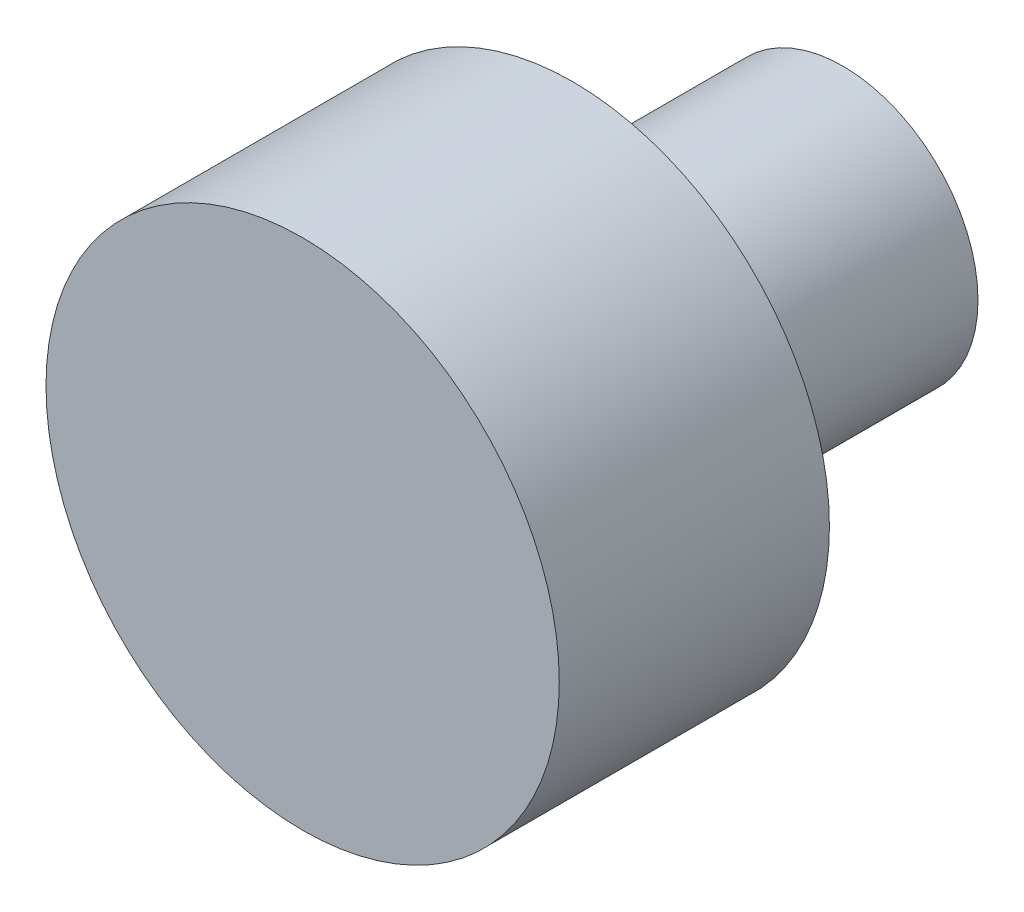
ISO-10303-21;
HEADER;
FILE_DESCRIPTION(('STEP AP214'),'2;1');
FILE_NAME('part.step','',(''),(''),'','','');
FILE_SCHEMA(('AUTOMOTIVE_DESIGN { 1 0 10303 214 1 1 1 1 }'));
ENDSEC;
DATA;
#1=APPLICATION_CONTEXT('core data for automotive mechanical design processes');
#2=APPLICATION_PROTOCOL_DEFINITION('international standard','automotive_design',2000,#1);
#3=PRODUCT_CONTEXT('',#1,'mechanical');
#4=PRODUCT('Part','Part','',(#3));
#5=PRODUCT_RELATED_PRODUCT_CATEGORY('part','',(#4));
#6=PRODUCT_DEFINITION_FORMATION('','',#4);
#7=PRODUCT_DEFINITION_CONTEXT('part definition',#1,'design');
#8=PRODUCT_DEFINITION('design','',#6,#7);
#9=PRODUCT_DEFINITION_SHAPE('','',#8);
#10=(LENGTH_UNIT() NAMED_UNIT(*) SI_UNIT(.MILLI.,.METRE.));
#11=(NAMED_UNIT(*) PLANE_ANGLE_UNIT() SI_UNIT($,.RADIAN.));
#12=(NAMED_UNIT(*) SI_UNIT($,.STERADIAN.) SOLID_ANGLE_UNIT());
#13=UNCERTAINTY_MEASURE_WITH_UNIT(LENGTH_MEASURE(1.E-05),#10,'distance_accuracy_value','');
#14=(GEOMETRIC_REPRESENTATION_CONTEXT(3) GLOBAL_UNCERTAINTY_ASSIGNED_CONTEXT((#13)) GLOBAL_UNIT_ASSIGNED_CONTEXT((#10,
#11,#12)) REPRESENTATION_CONTEXT('',''));
#15=CARTESIAN_POINT('',(0.,0.,0.));
#16=DIRECTION('',(0.,0.,1.));
#17=DIRECTION('',(1.,0.,0.));
#18=AXIS2_PLACEMENT_3D('',#15,#16,#17);
#19=CARTESIAN_POINT('',(0.,0.,0.));
#20=DIRECTION('',(0.,0.,-1.));
#21=DIRECTION('',(-1.,0.,0.));
#22=AXIS2_PLACEMENT_3D('',#19,#20,#21);
#23=CYLINDRICAL_SURFACE('',#22,1.);
#24=CARTESIAN_POINT('',(0.,0.,0.));
#25=DIRECTION('',(0.,0.,1.));
#26=DIRECTION('',(1.,0.,0.));
#27=AXIS2_PLACEMENT_3D('',#24,#25,#26);
#28=CIRCLE('',#27,1.);
#29=CARTESIAN_POINT('',(1.,0.,0.));
#30=VERTEX_POINT('',#29);
#31=EDGE_CURVE('E10',#30,#30,#28,.T.);
#32=ORIENTED_EDGE('',*,*,#31,.F.);
#33=EDGE_LOOP('',(#32));
#34=FACE_BOUND('',#33,.T.);
#35=CARTESIAN_POINT('',(0.,0.,-2.));
#36=DIRECTION('',(0.,0.,1.));
#37=DIRECTION('',(1.,0.,0.));
#38=AXIS2_PLACEMENT_3D('',#35,#36,#37);
#39=CIRCLE('',#38,1.);
#40=CARTESIAN_POINT('',(1.,0.,-2.));
#41=VERTEX_POINT('',#40);
#42=EDGE_CURVE('E45',#41,#41,#39,.T.);
#43=ORIENTED_EDGE('',*,*,#42,.T.);
#44=EDGE_LOOP('',(#43));
#45=FACE_BOUND('',#44,.T.);
#46=ADVANCED_FACE('F39',(#34,#45),#23,.T.);
#47=CARTESIAN_POINT('',(0.,0.,-2.));
#48=DIRECTION('',(0.,0.,1.));
#49=DIRECTION('',(1.,0.,0.));
#50=AXIS2_PLACEMENT_3D('',#47,#48,#49);
#51=PLANE('',#50);
#52=ORIENTED_EDGE('',*,*,#42,.F.);
#53=EDGE_LOOP('',(#52));
#54=FACE_BOUND('',#53,.T.);
#55=ADVANCED_FACE('F62',(#54),#51,.F.);
#56=CARTESIAN_POINT('',(0.,0.,2.));
#57=DIRECTION('',(0.,0.,-1.));
#58=DIRECTION('',(-1.,0.,0.));
#59=AXIS2_PLACEMENT_3D('',#56,#57,#58);
#60=CYLINDRICAL_SURFACE('',#59,1.9);
#61=CARTESIAN_POINT('',(0.,0.,2.));
#62=DIRECTION('',(0.,0.,1.));
#63=DIRECTION('',(1.,0.,0.));
#64=AXIS2_PLACEMENT_3D('',#61,#62,#63);
#65=CIRCLE('',#64,1.9);
#66=CARTESIAN_POINT('',(1.9,0.,2.));
#67=VERTEX_POINT('',#66);
#68=EDGE_CURVE('E47',#67,#67,#65,.T.);
#69=ORIENTED_EDGE('',*,*,#68,.F.);
#70=EDGE_LOOP('',(#69));
#71=FACE_BOUND('',#70,.T.);
#72=CARTESIAN_POINT('',(0.,0.,0.));
#73=DIRECTION('',(0.,0.,1.));
#74=DIRECTION('',(1.,0.,0.));
#75=AXIS2_PLACEMENT_3D('',#72,#73,#74);
#76=CIRCLE('',#75,1.9);
#77=CARTESIAN_POINT('',(1.9,0.,0.));
#78=VERTEX_POINT('',#77);
#79=EDGE_CURVE('E51',#78,#78,#76,.T.);
#80=ORIENTED_EDGE('',*,*,#79,.T.);
#81=EDGE_LOOP('',(#80));
#82=FACE_BOUND('',#81,.T.);
#83=ADVANCED_FACE('F56',(#71,#82),#60,.T.);
#84=CARTESIAN_POINT('',(0.,0.,2.));
#85=DIRECTION('',(0.,0.,1.));
#86=DIRECTION('',(1.,0.,0.));
#87=AXIS2_PLACEMENT_3D('',#84,#85,#86);
#88=PLANE('',#87);
#89=ORIENTED_EDGE('',*,*,#68,.T.);
#90=EDGE_LOOP('',(#89));
#91=FACE_BOUND('',#90,.T.);
#92=ADVANCED_FACE('F60',(#91),#88,.T.);
#93=CARTESIAN_POINT('',(0.,0.,0.));
#94=DIRECTION('',(0.,0.,1.));
#95=DIRECTION('',(1.,0.,0.));
#96=AXIS2_PLACEMENT_3D('',#93,#94,#95);
#97=PLANE('',#96);
#98=ORIENTED_EDGE('',*,*,#31,.T.);
#99=EDGE_LOOP('',(#98));
#100=FACE_BOUND('',#99,.T.);
#101=ORIENTED_EDGE('',*,*,#79,.F.);
#102=EDGE_LOOP('',(#101));
#103=FACE_BOUND('',#102,.T.);
#104=ADVANCED_FACE('F67',(#100,#103),#97,.F.);
#105=CLOSED_SHELL('',(#46,#55,#83,#92,#104));
#106=MANIFOLD_SOLID_BREP('B2',#105);
#107=ADVANCED_BREP_SHAPE_REPRESENTATION('',(#18,#106),#14);
#108=SHAPE_DEFINITION_REPRESENTATION(#9,#107);
ENDSEC;
END-ISO-10303-21;
